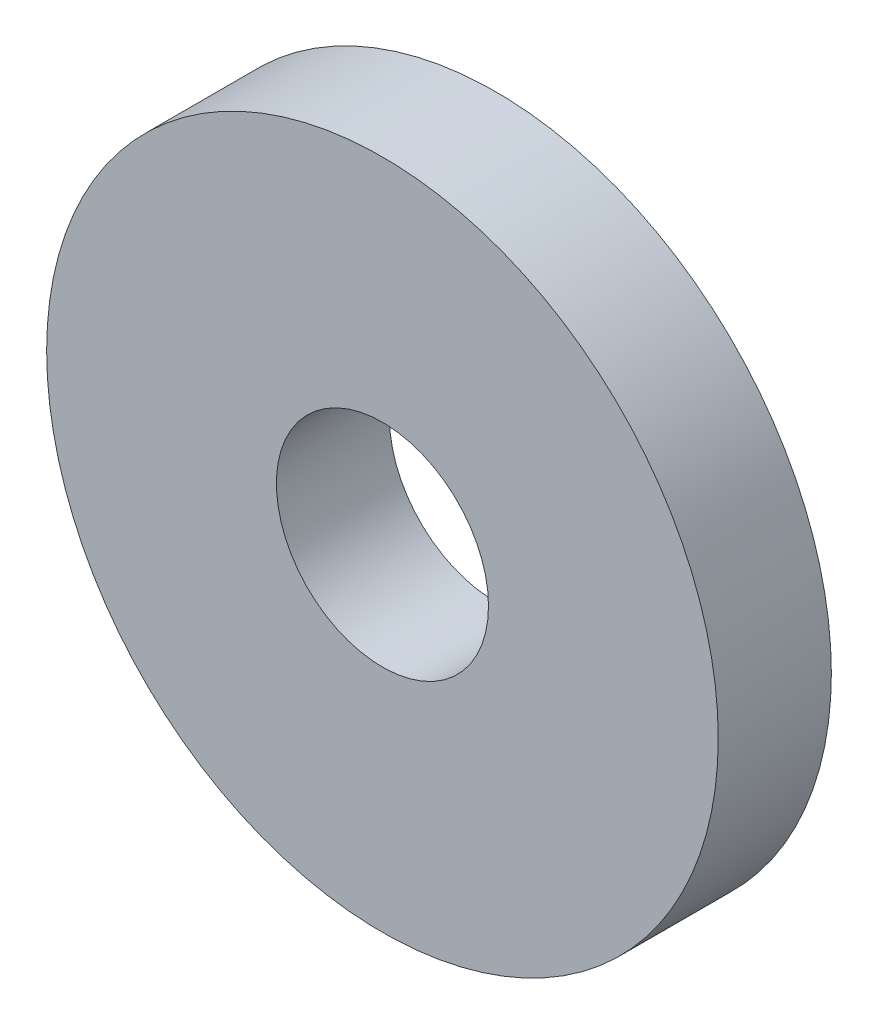
ISO-10303-21;
HEADER;
FILE_DESCRIPTION(('STEP AP214'),'2;1');
FILE_NAME('part.step','',(''),(''),'','','');
FILE_SCHEMA(('AUTOMOTIVE_DESIGN { 1 0 10303 214 1 1 1 1 }'));
ENDSEC;
DATA;
#1=APPLICATION_CONTEXT('core data for automotive mechanical design processes');
#2=APPLICATION_PROTOCOL_DEFINITION('international standard','automotive_design',2000,#1);
#3=PRODUCT_CONTEXT('',#1,'mechanical');
#4=PRODUCT('Part','Part','',(#3));
#5=PRODUCT_RELATED_PRODUCT_CATEGORY('part','',(#4));
#6=PRODUCT_DEFINITION_FORMATION('','',#4);
#7=PRODUCT_DEFINITION_CONTEXT('part definition',#1,'design');
#8=PRODUCT_DEFINITION('design','',#6,#7);
#9=PRODUCT_DEFINITION_SHAPE('','',#8);
#10=(LENGTH_UNIT() NAMED_UNIT(*) SI_UNIT(.MILLI.,.METRE.));
#11=(NAMED_UNIT(*) PLANE_ANGLE_UNIT() SI_UNIT($,.RADIAN.));
#12=(NAMED_UNIT(*) SI_UNIT($,.STERADIAN.) SOLID_ANGLE_UNIT());
#13=UNCERTAINTY_MEASURE_WITH_UNIT(LENGTH_MEASURE(1.E-05),#10,'distance_accuracy_value','');
#14=(GEOMETRIC_REPRESENTATION_CONTEXT(3) GLOBAL_UNCERTAINTY_ASSIGNED_CONTEXT((#13)) GLOBAL_UNIT_ASSIGNED_CONTEXT((#10,
#11,#12)) REPRESENTATION_CONTEXT('',''));
#15=CARTESIAN_POINT('',(0.,0.,0.));
#16=DIRECTION('',(0.,0.,1.));
#17=DIRECTION('',(1.,0.,0.));
#18=AXIS2_PLACEMENT_3D('',#15,#16,#17);
#19=CARTESIAN_POINT('',(0.,0.,3.2));
#20=DIRECTION('',(0.,0.,1.));
#21=DIRECTION('',(1.,0.,0.));
#22=AXIS2_PLACEMENT_3D('',#19,#20,#21);
#23=PLANE('',#22);
#24=CARTESIAN_POINT('',(0.,0.,3.2));
#25=DIRECTION('',(0.,0.,1.));
#26=DIRECTION('',(1.,0.,0.));
#27=AXIS2_PLACEMENT_3D('',#24,#25,#26);
#28=CIRCLE('',#27,6.);
#29=CARTESIAN_POINT('',(6.,0.,3.2));
#30=VERTEX_POINT('',#29);
#31=EDGE_CURVE('E27',#30,#30,#28,.T.);
#32=ORIENTED_EDGE('',*,*,#31,.F.);
#33=EDGE_LOOP('',(#32));
#34=FACE_BOUND('',#33,.T.);
#35=CARTESIAN_POINT('',(0.,0.,3.2));
#36=DIRECTION('',(0.,0.,-1.));
#37=DIRECTION('',(-1.,0.,0.));
#38=AXIS2_PLACEMENT_3D('',#35,#36,#37);
#39=CIRCLE('',#38,19.);
#40=CARTESIAN_POINT('',(-19.,0.,3.2));
#41=VERTEX_POINT('',#40);
#42=EDGE_CURVE('E9',#41,#41,#39,.T.);
#43=ORIENTED_EDGE('',*,*,#42,.F.);
#44=EDGE_LOOP('',(#43));
#45=FACE_BOUND('',#44,.T.);
#46=ADVANCED_FACE('F14',(#34,#45),#23,.T.);
#47=CARTESIAN_POINT('',(0.,0.,-3.2));
#48=DIRECTION('',(0.,0.,-1.));
#49=DIRECTION('',(-1.,0.,0.));
#50=AXIS2_PLACEMENT_3D('',#47,#48,#49);
#51=PLANE('',#50);
#52=CARTESIAN_POINT('',(0.,0.,-3.2));
#53=DIRECTION('',(0.,0.,-1.));
#54=DIRECTION('',(-1.,0.,0.));
#55=AXIS2_PLACEMENT_3D('',#52,#53,#54);
#56=CIRCLE('',#55,6.);
#57=CARTESIAN_POINT('',(-6.,0.,-3.2));
#58=VERTEX_POINT('',#57);
#59=EDGE_CURVE('E18',#58,#58,#56,.T.);
#60=ORIENTED_EDGE('',*,*,#59,.F.);
#61=EDGE_LOOP('',(#60));
#62=FACE_BOUND('',#61,.T.);
#63=CARTESIAN_POINT('',(0.,0.,-3.2));
#64=DIRECTION('',(0.,0.,1.));
#65=DIRECTION('',(1.,0.,0.));
#66=AXIS2_PLACEMENT_3D('',#63,#64,#65);
#67=CIRCLE('',#66,19.);
#68=CARTESIAN_POINT('',(19.,0.,-3.2));
#69=VERTEX_POINT('',#68);
#70=EDGE_CURVE('E22',#69,#69,#67,.T.);
#71=ORIENTED_EDGE('',*,*,#70,.F.);
#72=EDGE_LOOP('',(#71));
#73=FACE_BOUND('',#72,.T.);
#74=ADVANCED_FACE('F40',(#62,#73),#51,.T.);
#75=CARTESIAN_POINT('',(0.,0.,-3.2));
#76=DIRECTION('',(0.,0.,1.));
#77=DIRECTION('',(1.,0.,0.));
#78=AXIS2_PLACEMENT_3D('',#75,#76,#77);
#79=CYLINDRICAL_SURFACE('',#78,19.);
#80=ORIENTED_EDGE('',*,*,#42,.T.);
#81=EDGE_LOOP('',(#80));
#82=FACE_BOUND('',#81,.T.);
#83=ORIENTED_EDGE('',*,*,#70,.T.);
#84=EDGE_LOOP('',(#83));
#85=FACE_BOUND('',#84,.T.);
#86=ADVANCED_FACE('F16',(#82,#85),#79,.T.);
#87=CARTESIAN_POINT('',(0.,0.,-4.2));
#88=DIRECTION('',(0.,0.,1.));
#89=DIRECTION('',(1.,0.,0.));
#90=AXIS2_PLACEMENT_3D('',#87,#88,#89);
#91=CYLINDRICAL_SURFACE('',#90,6.);
#92=ORIENTED_EDGE('',*,*,#31,.T.);
#93=EDGE_LOOP('',(#92));
#94=FACE_BOUND('',#93,.T.);
#95=ORIENTED_EDGE('',*,*,#59,.T.);
#96=EDGE_LOOP('',(#95));
#97=FACE_BOUND('',#96,.T.);
#98=ADVANCED_FACE('F34',(#94,#97),#91,.F.);
#99=CLOSED_SHELL('',(#46,#74,#86,#98));
#100=MANIFOLD_SOLID_BREP('B1',#99);
#101=ADVANCED_BREP_SHAPE_REPRESENTATION('',(#18,#100),#14);
#102=SHAPE_DEFINITION_REPRESENTATION(#9,#101);
ENDSEC;
END-ISO-10303-21;
